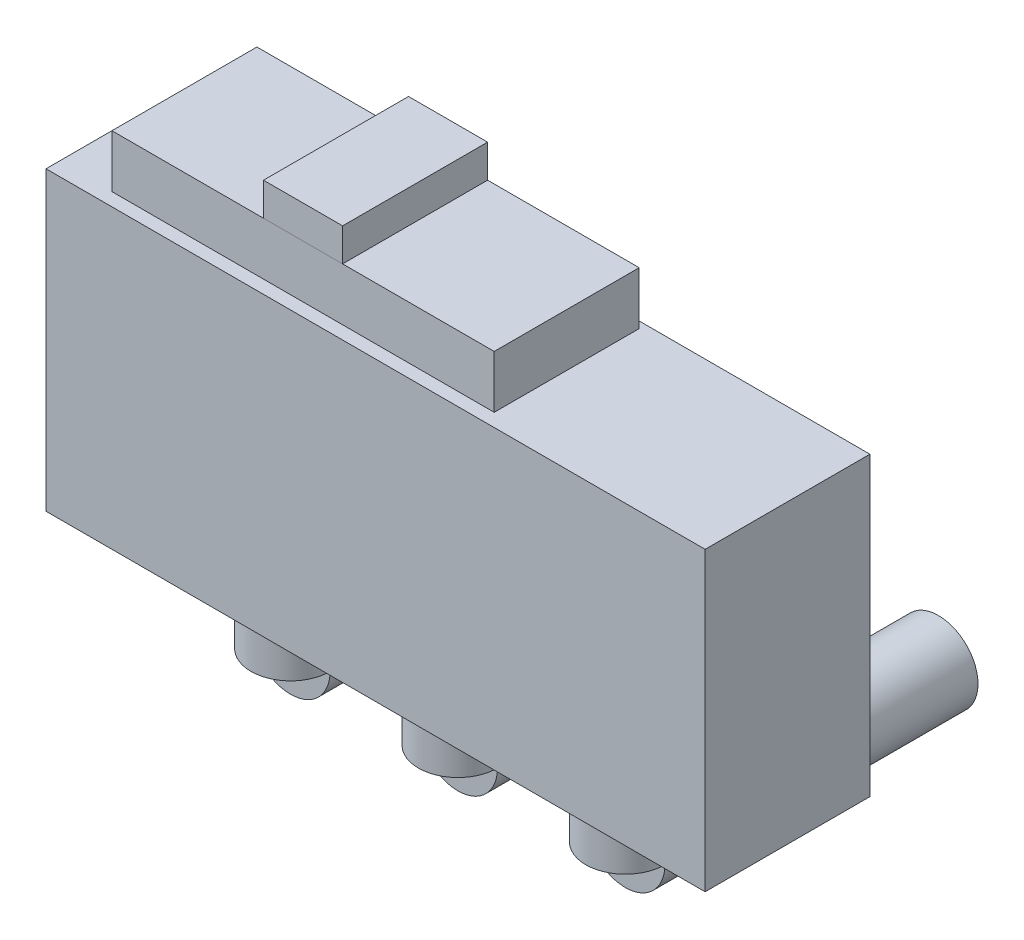
ISO-10303-21;
HEADER;
FILE_DESCRIPTION(('STEP AP214'),'2;1');
FILE_NAME('part.step','',(''),(''),'','','');
FILE_SCHEMA(('AUTOMOTIVE_DESIGN { 1 0 10303 214 1 1 1 1 }'));
ENDSEC;
DATA;
#1=APPLICATION_CONTEXT('core data for automotive mechanical design processes');
#2=APPLICATION_PROTOCOL_DEFINITION('international standard','automotive_design',2000,#1);
#3=PRODUCT_CONTEXT('',#1,'mechanical');
#4=PRODUCT('Part','Part','',(#3));
#5=PRODUCT_RELATED_PRODUCT_CATEGORY('part','',(#4));
#6=PRODUCT_DEFINITION_FORMATION('','',#4);
#7=PRODUCT_DEFINITION_CONTEXT('part definition',#1,'design');
#8=PRODUCT_DEFINITION('design','',#6,#7);
#9=PRODUCT_DEFINITION_SHAPE('','',#8);
#10=(LENGTH_UNIT() NAMED_UNIT(*) SI_UNIT(.MILLI.,.METRE.));
#11=(NAMED_UNIT(*) PLANE_ANGLE_UNIT() SI_UNIT($,.RADIAN.));
#12=(NAMED_UNIT(*) SI_UNIT($,.STERADIAN.) SOLID_ANGLE_UNIT());
#13=UNCERTAINTY_MEASURE_WITH_UNIT(LENGTH_MEASURE(1.E-05),#10,'distance_accuracy_value','');
#14=(GEOMETRIC_REPRESENTATION_CONTEXT(3) GLOBAL_UNCERTAINTY_ASSIGNED_CONTEXT((#13)) GLOBAL_UNIT_ASSIGNED_CONTEXT((#10,
#11,#12)) REPRESENTATION_CONTEXT('',''));
#15=CARTESIAN_POINT('',(0.,0.,0.));
#16=DIRECTION('',(0.,0.,1.));
#17=DIRECTION('',(1.,0.,0.));
#18=AXIS2_PLACEMENT_3D('',#15,#16,#17);
#19=CARTESIAN_POINT('',(-2.54E-05,2.54E-06,-3.50000062));
#20=DIRECTION('',(0.,0.,-1.));
#21=DIRECTION('',(1.,0.,0.));
#22=AXIS2_PLACEMENT_3D('',#19,#20,#21);
#23=CYLINDRICAL_SURFACE('',#22,0.5999988);
#24=CARTESIAN_POINT('',(-2.54E-05,2.54E-06,-3.50000062));
#25=DIRECTION('',(0.,0.,1.));
#26=DIRECTION('',(1.,0.,0.));
#27=AXIS2_PLACEMENT_3D('',#24,#25,#26);
#28=CIRCLE('',#27,0.5999988);
#29=CARTESIAN_POINT('',(0.5999734,2.53999999985304E-06,-3.50000062));
#30=VERTEX_POINT('',#29);
#31=EDGE_CURVE('P0_E11',#30,#30,#28,.T.);
#32=ORIENTED_EDGE('',*,*,#31,.T.);
#33=DIRECTION('',(0.,0.,1.));
#34=VECTOR('',#33,1.);
#35=CARTESIAN_POINT('',(0.5999734,2.53999999985304E-06,-3.50000062));
#36=LINE('',#35,#34);
#37=CARTESIAN_POINT('',(0.5999734,2.53999999985304E-06,1.25000004));
#38=VERTEX_POINT('',#37);
#39=EDGE_CURVE('P0_E24',#30,#38,#36,.T.);
#40=ORIENTED_EDGE('',*,*,#39,.T.);
#41=CARTESIAN_POINT('',(-2.54E-05,2.54E-06,1.25000004));
#42=DIRECTION('',(0.,0.,1.));
#43=DIRECTION('',(1.,0.,0.));
#44=AXIS2_PLACEMENT_3D('',#41,#42,#43);
#45=CIRCLE('',#44,0.5999988);
#46=EDGE_CURVE('P0_E32',#38,#38,#45,.T.);
#47=ORIENTED_EDGE('',*,*,#46,.F.);
#48=ORIENTED_EDGE('',*,*,#39,.F.);
#49=EDGE_LOOP('',(#32,#40,#47,#48));
#50=FACE_BOUND('',#49,.T.);
#51=ADVANCED_FACE('P0_F17',(#50),#23,.T.);
#52=CARTESIAN_POINT('',(-2.54000000000356E-05,2.53999999997551E-06,-3.50000062));
#53=DIRECTION('',(0.,0.,1.));
#54=DIRECTION('',(1.,0.,0.));
#55=AXIS2_PLACEMENT_3D('',#52,#53,#54);
#56=PLANE('',#55);
#57=ORIENTED_EDGE('',*,*,#31,.F.);
#58=EDGE_LOOP('',(#57));
#59=FACE_BOUND('',#58,.T.);
#60=ADVANCED_FACE('P0_F37',(#59),#56,.F.);
#61=CARTESIAN_POINT('',(-2.54000000000356E-05,2.53999999997551E-06,1.25000004));
#62=DIRECTION('',(0.,0.,1.));
#63=DIRECTION('',(1.,0.,0.));
#64=AXIS2_PLACEMENT_3D('',#61,#62,#63);
#65=PLANE('',#64);
#66=ORIENTED_EDGE('',*,*,#46,.T.);
#67=EDGE_LOOP('',(#66));
#68=FACE_BOUND('',#67,.T.);
#69=ADVANCED_FACE('P0_F34',(#68),#65,.T.);
#70=CLOSED_SHELL('',(#51,#60,#69));
#71=MANIFOLD_SOLID_BREP('P0_B1',#70);
#72=CARTESIAN_POINT('',(-5.00000016,1.1999976,0.));
#73=DIRECTION('',(0.,1.,0.));
#74=DIRECTION('',(1.,0.,0.));
#75=AXIS2_PLACEMENT_3D('',#72,#73,#74);
#76=PLANE('',#75);
#77=DIRECTION('',(1.,0.,0.));
#78=VECTOR('',#77,1.);
#79=CARTESIAN_POINT('',(-5.00000016,1.1999976,0.));
#80=LINE('',#79,#78);
#81=CARTESIAN_POINT('',(-5.00000016,1.1999976,0.));
#82=VERTEX_POINT('',#81);
#83=CARTESIAN_POINT('',(5.00000016,1.1999976,0.));
#84=VERTEX_POINT('',#83);
#85=EDGE_CURVE('P1_E11',#82,#84,#80,.T.);
#86=ORIENTED_EDGE('',*,*,#85,.T.);
#87=DIRECTION('',(0.,0.,1.));
#88=VECTOR('',#87,1.);
#89=CARTESIAN_POINT('',(5.00000016,1.1999976,0.));
#90=LINE('',#89,#88);
#91=CARTESIAN_POINT('',(5.00000016,1.1999976,2.50000008));
#92=VERTEX_POINT('',#91);
#93=EDGE_CURVE('P1_E24',#84,#92,#90,.T.);
#94=ORIENTED_EDGE('',*,*,#93,.T.);
#95=DIRECTION('',(1.,0.,0.));
#96=VECTOR('',#95,1.);
#97=CARTESIAN_POINT('',(-5.00000016,1.1999976,2.50000008));
#98=LINE('',#97,#96);
#99=CARTESIAN_POINT('',(-5.00000016,1.1999976,2.50000008));
#100=VERTEX_POINT('',#99);
#101=EDGE_CURVE('P1_E87',#100,#92,#98,.T.);
#102=ORIENTED_EDGE('',*,*,#101,.F.);
#103=DIRECTION('',(0.,0.,1.));
#104=VECTOR('',#103,1.);
#105=CARTESIAN_POINT('',(-5.00000016,1.1999976,0.));
#106=LINE('',#105,#104);
#107=EDGE_CURVE('P1_E36',#82,#100,#106,.T.);
#108=ORIENTED_EDGE('',*,*,#107,.F.);
#109=EDGE_LOOP('',(#86,#94,#102,#108));
#110=FACE_BOUND('',#109,.T.);
#111=ADVANCED_FACE('P1_F17',(#110),#76,.F.);
#112=CARTESIAN_POINT('',(5.00000016,1.1999976,0.));
#113=DIRECTION('',(-1.,0.,0.));
#114=DIRECTION('',(0.,1.,0.));
#115=AXIS2_PLACEMENT_3D('',#112,#113,#114);
#116=PLANE('',#115);
#117=DIRECTION('',(0.,1.,0.));
#118=VECTOR('',#117,1.);
#119=CARTESIAN_POINT('',(5.00000016,1.1999976,0.));
#120=LINE('',#119,#118);
#121=CARTESIAN_POINT('',(5.00000016,5.69999622,0.));
#122=VERTEX_POINT('',#121);
#123=EDGE_CURVE('P1_E84',#84,#122,#120,.T.);
#124=ORIENTED_EDGE('',*,*,#123,.T.);
#125=DIRECTION('',(0.,0.,1.));
#126=VECTOR('',#125,1.);
#127=CARTESIAN_POINT('',(5.00000016,5.69999622,0.));
#128=LINE('',#127,#126);
#129=CARTESIAN_POINT('',(5.00000016,5.69999622,2.50000008));
#130=VERTEX_POINT('',#129);
#131=EDGE_CURVE('P1_E82',#122,#130,#128,.T.);
#132=ORIENTED_EDGE('',*,*,#131,.T.);
#133=DIRECTION('',(0.,1.,0.));
#134=VECTOR('',#133,1.);
#135=CARTESIAN_POINT('',(5.00000016,1.1999976,2.50000008));
#136=LINE('',#135,#134);
#137=EDGE_CURVE('P1_E62',#92,#130,#136,.T.);
#138=ORIENTED_EDGE('',*,*,#137,.F.);
#139=ORIENTED_EDGE('',*,*,#93,.F.);
#140=EDGE_LOOP('',(#124,#132,#138,#139));
#141=FACE_BOUND('',#140,.T.);
#142=ADVANCED_FACE('P1_F89',(#141),#116,.F.);
#143=CARTESIAN_POINT('',(5.00000016,5.69999622,0.));
#144=DIRECTION('',(0.,-1.,0.));
#145=DIRECTION('',(-1.,0.,0.));
#146=AXIS2_PLACEMENT_3D('',#143,#144,#145);
#147=PLANE('',#146);
#148=DIRECTION('',(-1.,0.,0.));
#149=VECTOR('',#148,1.);
#150=CARTESIAN_POINT('',(5.00000016,5.69999622,0.));
#151=LINE('',#150,#149);
#152=CARTESIAN_POINT('',(-5.00000016,5.69999622,0.));
#153=VERTEX_POINT('',#152);
#154=EDGE_CURVE('P1_E71',#122,#153,#151,.T.);
#155=ORIENTED_EDGE('',*,*,#154,.T.);
#156=DIRECTION('',(0.,0.,1.));
#157=VECTOR('',#156,1.);
#158=CARTESIAN_POINT('',(-5.00000016,5.69999622,0.));
#159=LINE('',#158,#157);
#160=CARTESIAN_POINT('',(-5.00000016,5.69999622,2.50000008));
#161=VERTEX_POINT('',#160);
#162=EDGE_CURVE('P1_E65',#153,#161,#159,.T.);
#163=ORIENTED_EDGE('',*,*,#162,.T.);
#164=DIRECTION('',(-1.,0.,0.));
#165=VECTOR('',#164,1.);
#166=CARTESIAN_POINT('',(5.00000016,5.69999622,2.50000008));
#167=LINE('',#166,#165);
#168=EDGE_CURVE('P1_E57',#130,#161,#167,.T.);
#169=ORIENTED_EDGE('',*,*,#168,.F.);
#170=ORIENTED_EDGE('',*,*,#131,.F.);
#171=EDGE_LOOP('',(#155,#163,#169,#170));
#172=FACE_BOUND('',#171,.T.);
#173=ADVANCED_FACE('P1_F69',(#172),#147,.F.);
#174=CARTESIAN_POINT('',(-5.00000016,5.69999622,0.));
#175=DIRECTION('',(1.,0.,0.));
#176=DIRECTION('',(0.,-1.,0.));
#177=AXIS2_PLACEMENT_3D('',#174,#175,#176);
#178=PLANE('',#177);
#179=DIRECTION('',(0.,-1.,0.));
#180=VECTOR('',#179,1.);
#181=CARTESIAN_POINT('',(-5.00000016,5.69999622,0.));
#182=LINE('',#181,#180);
#183=EDGE_CURVE('P1_E66',#153,#82,#182,.T.);
#184=ORIENTED_EDGE('',*,*,#183,.T.);
#185=ORIENTED_EDGE('',*,*,#107,.T.);
#186=DIRECTION('',(0.,-1.,0.));
#187=VECTOR('',#186,1.);
#188=CARTESIAN_POINT('',(-5.00000016,5.69999622,2.50000008));
#189=LINE('',#188,#187);
#190=EDGE_CURVE('P1_E61',#161,#100,#189,.T.);
#191=ORIENTED_EDGE('',*,*,#190,.F.);
#192=ORIENTED_EDGE('',*,*,#162,.F.);
#193=EDGE_LOOP('',(#184,#185,#191,#192));
#194=FACE_BOUND('',#193,.T.);
#195=ADVANCED_FACE('P1_F76',(#194),#178,.F.);
#196=CARTESIAN_POINT('',(0.,3.44999691,0.));
#197=DIRECTION('',(0.,0.,1.));
#198=DIRECTION('',(-1.,0.,0.));
#199=AXIS2_PLACEMENT_3D('',#196,#197,#198);
#200=PLANE('',#199);
#201=ORIENTED_EDGE('',*,*,#183,.F.);
#202=ORIENTED_EDGE('',*,*,#154,.F.);
#203=ORIENTED_EDGE('',*,*,#123,.F.);
#204=ORIENTED_EDGE('',*,*,#85,.F.);
#205=EDGE_LOOP('',(#201,#202,#203,#204));
#206=FACE_BOUND('',#205,.T.);
#207=ADVANCED_FACE('P1_F91',(#206),#200,.F.);
#208=CARTESIAN_POINT('',(0.,3.44999691,2.50000008));
#209=DIRECTION('',(0.,0.,1.));
#210=DIRECTION('',(-1.,0.,0.));
#211=AXIS2_PLACEMENT_3D('',#208,#209,#210);
#212=PLANE('',#211);
#213=ORIENTED_EDGE('',*,*,#101,.T.);
#214=ORIENTED_EDGE('',*,*,#137,.T.);
#215=ORIENTED_EDGE('',*,*,#168,.T.);
#216=ORIENTED_EDGE('',*,*,#190,.T.);
#217=EDGE_LOOP('',(#213,#214,#215,#216));
#218=FACE_BOUND('',#217,.T.);
#219=ADVANCED_FACE('P1_F59',(#218),#212,.T.);
#220=CLOSED_SHELL('',(#111,#142,#173,#195,#207,#219));
#221=MANIFOLD_SOLID_BREP('P1_B1',#220);
#222=CARTESIAN_POINT('',(2.5399746,2.54E-06,-3.50000062));
#223=DIRECTION('',(0.,0.,-1.));
#224=DIRECTION('',(1.,0.,0.));
#225=AXIS2_PLACEMENT_3D('',#222,#223,#224);
#226=CYLINDRICAL_SURFACE('',#225,0.5999988);
#227=CARTESIAN_POINT('',(2.5399746,2.54E-06,-3.50000062));
#228=DIRECTION('',(0.,0.,1.));
#229=DIRECTION('',(1.,0.,0.));
#230=AXIS2_PLACEMENT_3D('',#227,#228,#229);
#231=CIRCLE('',#230,0.5999988);
#232=CARTESIAN_POINT('',(3.1399734,2.53999999985304E-06,-3.50000062));
#233=VERTEX_POINT('',#232);
#234=EDGE_CURVE('P2_E11',#233,#233,#231,.T.);
#235=ORIENTED_EDGE('',*,*,#234,.T.);
#236=DIRECTION('',(0.,0.,1.));
#237=VECTOR('',#236,1.);
#238=CARTESIAN_POINT('',(3.1399734,2.53999999985304E-06,-3.50000062));
#239=LINE('',#238,#237);
#240=CARTESIAN_POINT('',(3.1399734,2.53999999985304E-06,1.25000004));
#241=VERTEX_POINT('',#240);
#242=EDGE_CURVE('P2_E24',#233,#241,#239,.T.);
#243=ORIENTED_EDGE('',*,*,#242,.T.);
#244=CARTESIAN_POINT('',(2.5399746,2.54E-06,1.25000004));
#245=DIRECTION('',(0.,0.,1.));
#246=DIRECTION('',(1.,0.,0.));
#247=AXIS2_PLACEMENT_3D('',#244,#245,#246);
#248=CIRCLE('',#247,0.5999988);
#249=EDGE_CURVE('P2_E32',#241,#241,#248,.T.);
#250=ORIENTED_EDGE('',*,*,#249,.F.);
#251=ORIENTED_EDGE('',*,*,#242,.F.);
#252=EDGE_LOOP('',(#235,#243,#250,#251));
#253=FACE_BOUND('',#252,.T.);
#254=ADVANCED_FACE('P2_F17',(#253),#226,.T.);
#255=CARTESIAN_POINT('',(2.5399746,2.53999999997551E-06,-3.50000062));
#256=DIRECTION('',(0.,0.,1.));
#257=DIRECTION('',(1.,0.,0.));
#258=AXIS2_PLACEMENT_3D('',#255,#256,#257);
#259=PLANE('',#258);
#260=ORIENTED_EDGE('',*,*,#234,.F.);
#261=EDGE_LOOP('',(#260));
#262=FACE_BOUND('',#261,.T.);
#263=ADVANCED_FACE('P2_F37',(#262),#259,.F.);
#264=CARTESIAN_POINT('',(2.5399746,2.53999999997551E-06,1.25000004));
#265=DIRECTION('',(0.,0.,1.));
#266=DIRECTION('',(1.,0.,0.));
#267=AXIS2_PLACEMENT_3D('',#264,#265,#266);
#268=PLANE('',#267);
#269=ORIENTED_EDGE('',*,*,#249,.T.);
#270=EDGE_LOOP('',(#269));
#271=FACE_BOUND('',#270,.T.);
#272=ADVANCED_FACE('P2_F34',(#271),#268,.T.);
#273=CLOSED_SHELL('',(#254,#263,#272));
#274=MANIFOLD_SOLID_BREP('P2_B1',#273);
#275=CARTESIAN_POINT('',(-2.5400254,2.54E-06,-3.50000062));
#276=DIRECTION('',(0.,0.,-1.));
#277=DIRECTION('',(1.,0.,0.));
#278=AXIS2_PLACEMENT_3D('',#275,#276,#277);
#279=CYLINDRICAL_SURFACE('',#278,0.5999988);
#280=CARTESIAN_POINT('',(-2.5400254,2.54E-06,-3.50000062));
#281=DIRECTION('',(0.,0.,1.));
#282=DIRECTION('',(1.,0.,0.));
#283=AXIS2_PLACEMENT_3D('',#280,#281,#282);
#284=CIRCLE('',#283,0.5999988);
#285=CARTESIAN_POINT('',(-1.9400266,2.53999999985304E-06,-3.50000062));
#286=VERTEX_POINT('',#285);
#287=EDGE_CURVE('P3_E11',#286,#286,#284,.T.);
#288=ORIENTED_EDGE('',*,*,#287,.T.);
#289=DIRECTION('',(0.,0.,1.));
#290=VECTOR('',#289,1.);
#291=CARTESIAN_POINT('',(-1.9400266,2.53999999985304E-06,-3.50000062));
#292=LINE('',#291,#290);
#293=CARTESIAN_POINT('',(-1.9400266,2.53999999985304E-06,1.25000004));
#294=VERTEX_POINT('',#293);
#295=EDGE_CURVE('P3_E24',#286,#294,#292,.T.);
#296=ORIENTED_EDGE('',*,*,#295,.T.);
#297=CARTESIAN_POINT('',(-2.5400254,2.54E-06,1.25000004));
#298=DIRECTION('',(0.,0.,1.));
#299=DIRECTION('',(1.,0.,0.));
#300=AXIS2_PLACEMENT_3D('',#297,#298,#299);
#301=CIRCLE('',#300,0.5999988);
#302=EDGE_CURVE('P3_E32',#294,#294,#301,.T.);
#303=ORIENTED_EDGE('',*,*,#302,.F.);
#304=ORIENTED_EDGE('',*,*,#295,.F.);
#305=EDGE_LOOP('',(#288,#296,#303,#304));
#306=FACE_BOUND('',#305,.T.);
#307=ADVANCED_FACE('P3_F17',(#306),#279,.T.);
#308=CARTESIAN_POINT('',(-2.5400254,2.53999999997551E-06,-3.50000062));
#309=DIRECTION('',(0.,0.,1.));
#310=DIRECTION('',(1.,0.,0.));
#311=AXIS2_PLACEMENT_3D('',#308,#309,#310);
#312=PLANE('',#311);
#313=ORIENTED_EDGE('',*,*,#287,.F.);
#314=EDGE_LOOP('',(#313));
#315=FACE_BOUND('',#314,.T.);
#316=ADVANCED_FACE('P3_F37',(#315),#312,.F.);
#317=CARTESIAN_POINT('',(-2.5400254,2.53999999997551E-06,1.25000004));
#318=DIRECTION('',(0.,0.,1.));
#319=DIRECTION('',(1.,0.,0.));
#320=AXIS2_PLACEMENT_3D('',#317,#318,#319);
#321=PLANE('',#320);
#322=ORIENTED_EDGE('',*,*,#302,.T.);
#323=EDGE_LOOP('',(#322));
#324=FACE_BOUND('',#323,.T.);
#325=ADVANCED_FACE('P3_F34',(#324),#321,.T.);
#326=CLOSED_SHELL('',(#307,#316,#325));
#327=MANIFOLD_SOLID_BREP('P3_B1',#326);
#328=CARTESIAN_POINT('',(-2.5400254,2.032E-05,1.25000004));
#329=DIRECTION('',(0.,-1.,0.));
#330=DIRECTION('',(0.,0.,1.));
#331=AXIS2_PLACEMENT_3D('',#328,#329,#330);
#332=CYLINDRICAL_SURFACE('',#331,0.5999988);
#333=CARTESIAN_POINT('',(-2.5400254,2.032E-05,1.25000004));
#334=DIRECTION('',(0.,1.,0.));
#335=DIRECTION('',(0.,0.,1.));
#336=AXIS2_PLACEMENT_3D('',#333,#334,#335);
#337=CIRCLE('',#336,0.5999988);
#338=CARTESIAN_POINT('',(-2.5400254,2.03199999999633E-05,1.84999884));
#339=VERTEX_POINT('',#338);
#340=EDGE_CURVE('P4_E11',#339,#339,#337,.T.);
#341=ORIENTED_EDGE('',*,*,#340,.T.);
#342=DIRECTION('',(0.,1.,0.));
#343=VECTOR('',#342,1.);
#344=CARTESIAN_POINT('',(-2.5400254,2.03199999999633E-05,1.84999884));
#345=LINE('',#344,#343);
#346=CARTESIAN_POINT('',(-2.5400254,1.20002046,1.84999884));
#347=VERTEX_POINT('',#346);
#348=EDGE_CURVE('P4_E24',#339,#347,#345,.T.);
#349=ORIENTED_EDGE('',*,*,#348,.T.);
#350=CARTESIAN_POINT('',(-2.5400254,1.20002046,1.25000004));
#351=DIRECTION('',(0.,1.,0.));
#352=DIRECTION('',(0.,0.,1.));
#353=AXIS2_PLACEMENT_3D('',#350,#351,#352);
#354=CIRCLE('',#353,0.5999988);
#355=EDGE_CURVE('P4_E32',#347,#347,#354,.T.);
#356=ORIENTED_EDGE('',*,*,#355,.F.);
#357=ORIENTED_EDGE('',*,*,#348,.F.);
#358=EDGE_LOOP('',(#341,#349,#356,#357));
#359=FACE_BOUND('',#358,.T.);
#360=ADVANCED_FACE('P4_F17',(#359),#332,.T.);
#361=CARTESIAN_POINT('',(-2.5400254,2.032E-05,1.25000004));
#362=DIRECTION('',(0.,1.,0.));
#363=DIRECTION('',(0.,0.,1.));
#364=AXIS2_PLACEMENT_3D('',#361,#362,#363);
#365=PLANE('',#364);
#366=ORIENTED_EDGE('',*,*,#340,.F.);
#367=EDGE_LOOP('',(#366));
#368=FACE_BOUND('',#367,.T.);
#369=ADVANCED_FACE('P4_F37',(#368),#365,.F.);
#370=CARTESIAN_POINT('',(-2.5400254,1.20002046,1.25000004));
#371=DIRECTION('',(0.,1.,0.));
#372=DIRECTION('',(0.,0.,1.));
#373=AXIS2_PLACEMENT_3D('',#370,#371,#372);
#374=PLANE('',#373);
#375=ORIENTED_EDGE('',*,*,#355,.T.);
#376=EDGE_LOOP('',(#375));
#377=FACE_BOUND('',#376,.T.);
#378=ADVANCED_FACE('P4_F34',(#377),#374,.T.);
#379=CLOSED_SHELL('',(#360,#369,#378));
#380=MANIFOLD_SOLID_BREP('P4_B1',#379);
#381=CARTESIAN_POINT('',(-2.54E-05,2.032E-05,1.25000004));
#382=DIRECTION('',(0.,-1.,0.));
#383=DIRECTION('',(0.,0.,1.));
#384=AXIS2_PLACEMENT_3D('',#381,#382,#383);
#385=CYLINDRICAL_SURFACE('',#384,0.5999988);
#386=CARTESIAN_POINT('',(-2.54E-05,2.032E-05,1.25000004));
#387=DIRECTION('',(0.,1.,0.));
#388=DIRECTION('',(0.,0.,1.));
#389=AXIS2_PLACEMENT_3D('',#386,#387,#388);
#390=CIRCLE('',#389,0.5999988);
#391=CARTESIAN_POINT('',(-2.54E-05,2.03199999999633E-05,1.84999884));
#392=VERTEX_POINT('',#391);
#393=EDGE_CURVE('P5_E11',#392,#392,#390,.T.);
#394=ORIENTED_EDGE('',*,*,#393,.T.);
#395=DIRECTION('',(0.,1.,0.));
#396=VECTOR('',#395,1.);
#397=CARTESIAN_POINT('',(-2.54E-05,2.03199999999633E-05,1.84999884));
#398=LINE('',#397,#396);
#399=CARTESIAN_POINT('',(-2.53999999997796E-05,1.20002046,1.84999884));
#400=VERTEX_POINT('',#399);
#401=EDGE_CURVE('P5_E24',#392,#400,#398,.T.);
#402=ORIENTED_EDGE('',*,*,#401,.T.);
#403=CARTESIAN_POINT('',(-2.53999999997796E-05,1.20002046,1.25000004));
#404=DIRECTION('',(0.,1.,0.));
#405=DIRECTION('',(0.,0.,1.));
#406=AXIS2_PLACEMENT_3D('',#403,#404,#405);
#407=CIRCLE('',#406,0.5999988);
#408=EDGE_CURVE('P5_E32',#400,#400,#407,.T.);
#409=ORIENTED_EDGE('',*,*,#408,.F.);
#410=ORIENTED_EDGE('',*,*,#401,.F.);
#411=EDGE_LOOP('',(#394,#402,#409,#410));
#412=FACE_BOUND('',#411,.T.);
#413=ADVANCED_FACE('P5_F17',(#412),#385,.T.);
#414=CARTESIAN_POINT('',(-2.54000000000245E-05,2.032E-05,1.25000004));
#415=DIRECTION('',(0.,1.,0.));
#416=DIRECTION('',(0.,0.,1.));
#417=AXIS2_PLACEMENT_3D('',#414,#415,#416);
#418=PLANE('',#417);
#419=ORIENTED_EDGE('',*,*,#393,.F.);
#420=EDGE_LOOP('',(#419));
#421=FACE_BOUND('',#420,.T.);
#422=ADVANCED_FACE('P5_F37',(#421),#418,.F.);
#423=CARTESIAN_POINT('',(-2.53999999998041E-05,1.20002046,1.25000004));
#424=DIRECTION('',(0.,1.,0.));
#425=DIRECTION('',(0.,0.,1.));
#426=AXIS2_PLACEMENT_3D('',#423,#424,#425);
#427=PLANE('',#426);
#428=ORIENTED_EDGE('',*,*,#408,.T.);
#429=EDGE_LOOP('',(#428));
#430=FACE_BOUND('',#429,.T.);
#431=ADVANCED_FACE('P5_F34',(#430),#427,.T.);
#432=CLOSED_SHELL('',(#413,#422,#431));
#433=MANIFOLD_SOLID_BREP('P5_B1',#432);
#434=CARTESIAN_POINT('',(2.5399746,2.032E-05,1.25000004));
#435=DIRECTION('',(0.,-1.,0.));
#436=DIRECTION('',(0.,0.,1.));
#437=AXIS2_PLACEMENT_3D('',#434,#435,#436);
#438=CYLINDRICAL_SURFACE('',#437,0.5999988);
#439=CARTESIAN_POINT('',(2.5399746,2.032E-05,1.25000004));
#440=DIRECTION('',(0.,1.,0.));
#441=DIRECTION('',(0.,0.,1.));
#442=AXIS2_PLACEMENT_3D('',#439,#440,#441);
#443=CIRCLE('',#442,0.5999988);
#444=CARTESIAN_POINT('',(2.5399746,2.03199999999633E-05,1.84999884));
#445=VERTEX_POINT('',#444);
#446=EDGE_CURVE('P6_E11',#445,#445,#443,.T.);
#447=ORIENTED_EDGE('',*,*,#446,.T.);
#448=DIRECTION('',(0.,1.,0.));
#449=VECTOR('',#448,1.);
#450=CARTESIAN_POINT('',(2.5399746,2.03199999999633E-05,1.84999884));
#451=LINE('',#450,#449);
#452=CARTESIAN_POINT('',(2.5399746,1.20002046,1.84999884));
#453=VERTEX_POINT('',#452);
#454=EDGE_CURVE('P6_E24',#445,#453,#451,.T.);
#455=ORIENTED_EDGE('',*,*,#454,.T.);
#456=CARTESIAN_POINT('',(2.5399746,1.20002046,1.25000004));
#457=DIRECTION('',(0.,1.,0.));
#458=DIRECTION('',(0.,0.,1.));
#459=AXIS2_PLACEMENT_3D('',#456,#457,#458);
#460=CIRCLE('',#459,0.5999988);
#461=EDGE_CURVE('P6_E32',#453,#453,#460,.T.);
#462=ORIENTED_EDGE('',*,*,#461,.F.);
#463=ORIENTED_EDGE('',*,*,#454,.F.);
#464=EDGE_LOOP('',(#447,#455,#462,#463));
#465=FACE_BOUND('',#464,.T.);
#466=ADVANCED_FACE('P6_F17',(#465),#438,.T.);
#467=CARTESIAN_POINT('',(2.5399746,2.032E-05,1.25000004));
#468=DIRECTION('',(0.,1.,0.));
#469=DIRECTION('',(0.,0.,1.));
#470=AXIS2_PLACEMENT_3D('',#467,#468,#469);
#471=PLANE('',#470);
#472=ORIENTED_EDGE('',*,*,#446,.F.);
#473=EDGE_LOOP('',(#472));
#474=FACE_BOUND('',#473,.T.);
#475=ADVANCED_FACE('P6_F37',(#474),#471,.F.);
#476=CARTESIAN_POINT('',(2.5399746,1.20002046,1.25000004));
#477=DIRECTION('',(0.,1.,0.));
#478=DIRECTION('',(0.,0.,1.));
#479=AXIS2_PLACEMENT_3D('',#476,#477,#478);
#480=PLANE('',#479);
#481=ORIENTED_EDGE('',*,*,#461,.T.);
#482=EDGE_LOOP('',(#481));
#483=FACE_BOUND('',#482,.T.);
#484=ADVANCED_FACE('P6_F34',(#483),#480,.T.);
#485=CLOSED_SHELL('',(#466,#475,#484));
#486=MANIFOLD_SOLID_BREP('P6_B1',#485);
#487=CARTESIAN_POINT('',(-4.19999922,6.49999716,0.0999998));
#488=DIRECTION('',(0.,1.,0.));
#489=DIRECTION('',(1.,0.,0.));
#490=AXIS2_PLACEMENT_3D('',#487,#488,#489);
#491=PLANE('',#490);
#492=DIRECTION('',(0.,0.,1.));
#493=VECTOR('',#492,1.);
#494=CARTESIAN_POINT('',(-4.19999922,6.49999716,0.0999998));
#495=LINE('',#494,#493);
#496=CARTESIAN_POINT('',(-4.19999922,6.49999716,0.0999998));
#497=VERTEX_POINT('',#496);
#498=CARTESIAN_POINT('',(-4.19999922,6.49999716,2.30000048));
#499=VERTEX_POINT('',#498);
#500=EDGE_CURVE('P7_E11',#497,#499,#495,.T.);
#501=ORIENTED_EDGE('',*,*,#500,.T.);
#502=DIRECTION('',(1.,0.,0.));
#503=VECTOR('',#502,1.);
#504=CARTESIAN_POINT('',(-4.19999922,6.49999716,2.30000048));
#505=LINE('',#504,#503);
#506=CARTESIAN_POINT('',(1.59999934,6.49999716,2.30000048));
#507=VERTEX_POINT('',#506);
#508=EDGE_CURVE('P7_E24',#499,#507,#505,.T.);
#509=ORIENTED_EDGE('',*,*,#508,.T.);
#510=DIRECTION('',(0.,0.,1.));
#511=VECTOR('',#510,1.);
#512=CARTESIAN_POINT('',(1.59999934,6.49999716,0.0999998));
#513=LINE('',#512,#511);
#514=CARTESIAN_POINT('',(1.59999934,6.49999716,0.0999998));
#515=VERTEX_POINT('',#514);
#516=EDGE_CURVE('P7_E85',#515,#507,#513,.T.);
#517=ORIENTED_EDGE('',*,*,#516,.F.);
#518=DIRECTION('',(1.,0.,0.));
#519=VECTOR('',#518,1.);
#520=CARTESIAN_POINT('',(-4.19999922,6.49999716,0.0999998));
#521=LINE('',#520,#519);
#522=EDGE_CURVE('P7_E83',#497,#515,#521,.T.);
#523=ORIENTED_EDGE('',*,*,#522,.F.);
#524=EDGE_LOOP('',(#501,#509,#517,#523));
#525=FACE_BOUND('',#524,.T.);
#526=ADVANCED_FACE('P7_F17',(#525),#491,.T.);
#527=CARTESIAN_POINT('',(1.59999934,6.49999716,0.0999998));
#528=DIRECTION('',(1.,0.,0.));
#529=DIRECTION('',(0.,-1.,0.));
#530=AXIS2_PLACEMENT_3D('',#527,#528,#529);
#531=PLANE('',#530);
#532=ORIENTED_EDGE('',*,*,#516,.T.);
#533=DIRECTION('',(0.,-1.,0.));
#534=VECTOR('',#533,1.);
#535=CARTESIAN_POINT('',(1.59999934,6.49999716,2.30000048));
#536=LINE('',#535,#534);
#537=CARTESIAN_POINT('',(1.59999934,5.69999622,2.30000048));
#538=VERTEX_POINT('',#537);
#539=EDGE_CURVE('P7_E81',#507,#538,#536,.T.);
#540=ORIENTED_EDGE('',*,*,#539,.T.);
#541=DIRECTION('',(0.,0.,1.));
#542=VECTOR('',#541,1.);
#543=CARTESIAN_POINT('',(1.59999934,5.69999622,0.0999998));
#544=LINE('',#543,#542);
#545=CARTESIAN_POINT('',(1.59999934,5.69999622,0.0999998));
#546=VERTEX_POINT('',#545);
#547=EDGE_CURVE('P7_E79',#546,#538,#544,.T.);
#548=ORIENTED_EDGE('',*,*,#547,.F.);
#549=DIRECTION('',(0.,-1.,0.));
#550=VECTOR('',#549,1.);
#551=CARTESIAN_POINT('',(1.59999934,6.49999716,0.0999998));
#552=LINE('',#551,#550);
#553=EDGE_CURVE('P7_E70',#515,#546,#552,.T.);
#554=ORIENTED_EDGE('',*,*,#553,.F.);
#555=EDGE_LOOP('',(#532,#540,#548,#554));
#556=FACE_BOUND('',#555,.T.);
#557=ADVANCED_FACE('P7_F90',(#556),#531,.T.);
#558=CARTESIAN_POINT('',(1.59999934,5.69999622,0.0999998));
#559=DIRECTION('',(0.,-1.,0.));
#560=DIRECTION('',(-1.,0.,0.));
#561=AXIS2_PLACEMENT_3D('',#558,#559,#560);
#562=PLANE('',#561);
#563=ORIENTED_EDGE('',*,*,#547,.T.);
#564=DIRECTION('',(-1.,0.,0.));
#565=VECTOR('',#564,1.);
#566=CARTESIAN_POINT('',(1.59999934,5.69999622,2.30000048));
#567=LINE('',#566,#565);
#568=CARTESIAN_POINT('',(-4.19999922,5.69999622,2.30000048));
#569=VERTEX_POINT('',#568);
#570=EDGE_CURVE('P7_E60',#538,#569,#567,.T.);
#571=ORIENTED_EDGE('',*,*,#570,.T.);
#572=DIRECTION('',(0.,0.,1.));
#573=VECTOR('',#572,1.);
#574=CARTESIAN_POINT('',(-4.19999922,5.69999622,0.0999998));
#575=LINE('',#574,#573);
#576=CARTESIAN_POINT('',(-4.19999922,5.69999622,0.0999998));
#577=VERTEX_POINT('',#576);
#578=EDGE_CURVE('P7_E54',#577,#569,#575,.T.);
#579=ORIENTED_EDGE('',*,*,#578,.F.);
#580=DIRECTION('',(-1.,0.,0.));
#581=VECTOR('',#580,1.);
#582=CARTESIAN_POINT('',(1.59999934,5.69999622,0.0999998));
#583=LINE('',#582,#581);
#584=EDGE_CURVE('P7_E58',#546,#577,#583,.T.);
#585=ORIENTED_EDGE('',*,*,#584,.F.);
#586=EDGE_LOOP('',(#563,#571,#579,#585));
#587=FACE_BOUND('',#586,.T.);
#588=ADVANCED_FACE('P7_F57',(#587),#562,.T.);
#589=CARTESIAN_POINT('',(-4.19999922,5.69999622,0.0999998));
#590=DIRECTION('',(-1.,0.,0.));
#591=DIRECTION('',(0.,1.,0.));
#592=AXIS2_PLACEMENT_3D('',#589,#590,#591);
#593=PLANE('',#592);
#594=ORIENTED_EDGE('',*,*,#578,.T.);
#595=DIRECTION('',(0.,1.,0.));
#596=VECTOR('',#595,1.);
#597=CARTESIAN_POINT('',(-4.19999922,5.69999622,2.30000048));
#598=LINE('',#597,#596);
#599=EDGE_CURVE('P7_E71',#569,#499,#598,.T.);
#600=ORIENTED_EDGE('',*,*,#599,.T.);
#601=ORIENTED_EDGE('',*,*,#500,.F.);
#602=DIRECTION('',(0.,1.,0.));
#603=VECTOR('',#602,1.);
#604=CARTESIAN_POINT('',(-4.19999922,5.69999622,0.0999998));
#605=LINE('',#604,#603);
#606=EDGE_CURVE('P7_E68',#577,#497,#605,.T.);
#607=ORIENTED_EDGE('',*,*,#606,.F.);
#608=EDGE_LOOP('',(#594,#600,#601,#607));
#609=FACE_BOUND('',#608,.T.);
#610=ADVANCED_FACE('P7_F73',(#609),#593,.T.);
#611=CARTESIAN_POINT('',(-1.29999994,6.09999669,0.0999998));
#612=DIRECTION('',(0.,0.,-1.));
#613=DIRECTION('',(1.,0.,0.));
#614=AXIS2_PLACEMENT_3D('',#611,#612,#613);
#615=PLANE('',#614);
#616=ORIENTED_EDGE('',*,*,#522,.T.);
#617=ORIENTED_EDGE('',*,*,#553,.T.);
#618=ORIENTED_EDGE('',*,*,#584,.T.);
#619=ORIENTED_EDGE('',*,*,#606,.T.);
#620=EDGE_LOOP('',(#616,#617,#618,#619));
#621=FACE_BOUND('',#620,.T.);
#622=ADVANCED_FACE('P7_F67',(#621),#615,.T.);
#623=CARTESIAN_POINT('',(-1.29999994,6.09999669,2.30000048));
#624=DIRECTION('',(0.,0.,-1.));
#625=DIRECTION('',(1.,0.,0.));
#626=AXIS2_PLACEMENT_3D('',#623,#624,#625);
#627=PLANE('',#626);
#628=ORIENTED_EDGE('',*,*,#599,.F.);
#629=ORIENTED_EDGE('',*,*,#570,.F.);
#630=ORIENTED_EDGE('',*,*,#539,.F.);
#631=ORIENTED_EDGE('',*,*,#508,.F.);
#632=EDGE_LOOP('',(#628,#629,#630,#631));
#633=FACE_BOUND('',#632,.T.);
#634=ADVANCED_FACE('P7_F91',(#633),#627,.F.);
#635=CLOSED_SHELL('',(#526,#557,#588,#610,#622,#634));
#636=MANIFOLD_SOLID_BREP('P7_B1',#635);
#637=CARTESIAN_POINT('',(-1.89999874,6.9999987,0.0999998));
#638=DIRECTION('',(0.,1.,0.));
#639=DIRECTION('',(1.,0.,0.));
#640=AXIS2_PLACEMENT_3D('',#637,#638,#639);
#641=PLANE('',#640);
#642=DIRECTION('',(0.,0.,1.));
#643=VECTOR('',#642,1.);
#644=CARTESIAN_POINT('',(-1.89999874,6.9999987,0.0999998));
#645=LINE('',#644,#643);
#646=CARTESIAN_POINT('',(-1.89999874,6.9999987,0.0999998));
#647=VERTEX_POINT('',#646);
#648=CARTESIAN_POINT('',(-1.89999874,6.9999987,2.30000048));
#649=VERTEX_POINT('',#648);
#650=EDGE_CURVE('P8_E10',#647,#649,#645,.T.);
#651=ORIENTED_EDGE('',*,*,#650,.T.);
#652=DIRECTION('',(1.,0.,0.));
#653=VECTOR('',#652,1.);
#654=CARTESIAN_POINT('',(-1.89999874,6.9999987,2.30000048));
#655=LINE('',#654,#653);
#656=CARTESIAN_POINT('',(-0.70000114,6.9999987,2.30000048));
#657=VERTEX_POINT('',#656);
#658=EDGE_CURVE('P8_E23',#649,#657,#655,.T.);
#659=ORIENTED_EDGE('',*,*,#658,.T.);
#660=DIRECTION('',(0.,0.,1.));
#661=VECTOR('',#660,1.);
#662=CARTESIAN_POINT('',(-0.70000114,6.9999987,0.0999998));
#663=LINE('',#662,#661);
#664=CARTESIAN_POINT('',(-0.70000114,6.9999987,0.0999998));
#665=VERTEX_POINT('',#664);
#666=EDGE_CURVE('P8_E83',#665,#657,#663,.T.);
#667=ORIENTED_EDGE('',*,*,#666,.F.);
#668=DIRECTION('',(1.,0.,0.));
#669=VECTOR('',#668,1.);
#670=CARTESIAN_POINT('',(-1.89999874,6.9999987,0.0999998));
#671=LINE('',#670,#669);
#672=EDGE_CURVE('P8_E81',#647,#665,#671,.T.);
#673=ORIENTED_EDGE('',*,*,#672,.F.);
#674=EDGE_LOOP('',(#651,#659,#667,#673));
#675=FACE_BOUND('',#674,.T.);
#676=ADVANCED_FACE('P8_F16',(#675),#641,.T.);
#677=CARTESIAN_POINT('',(-0.70000114,6.9999987,0.0999998));
#678=DIRECTION('',(1.,0.,0.));
#679=DIRECTION('',(0.,-1.,0.));
#680=AXIS2_PLACEMENT_3D('',#677,#678,#679);
#681=PLANE('',#680);
#682=ORIENTED_EDGE('',*,*,#666,.T.);
#683=DIRECTION('',(0.,-1.,0.));
#684=VECTOR('',#683,1.);
#685=CARTESIAN_POINT('',(-0.70000114,6.9999987,2.30000048));
#686=LINE('',#685,#684);
#687=CARTESIAN_POINT('',(-0.70000114,6.49999716,2.30000048));
#688=VERTEX_POINT('',#687);
#689=EDGE_CURVE('P8_E78',#657,#688,#686,.T.);
#690=ORIENTED_EDGE('',*,*,#689,.T.);
#691=DIRECTION('',(0.,0.,1.));
#692=VECTOR('',#691,1.);
#693=CARTESIAN_POINT('',(-0.70000114,6.49999716,0.0999998));
#694=LINE('',#693,#692);
#695=CARTESIAN_POINT('',(-0.70000114,6.49999716,0.0999998));
#696=VERTEX_POINT('',#695);
#697=EDGE_CURVE('P8_E76',#696,#688,#694,.T.);
#698=ORIENTED_EDGE('',*,*,#697,.F.);
#699=DIRECTION('',(0.,-1.,0.));
#700=VECTOR('',#699,1.);
#701=CARTESIAN_POINT('',(-0.70000114,6.9999987,0.0999998));
#702=LINE('',#701,#700);
#703=EDGE_CURVE('P8_E67',#665,#696,#702,.T.);
#704=ORIENTED_EDGE('',*,*,#703,.F.);
#705=EDGE_LOOP('',(#682,#690,#698,#704));
#706=FACE_BOUND('',#705,.T.);
#707=ADVANCED_FACE('P8_F89',(#706),#681,.T.);
#708=CARTESIAN_POINT('',(-0.70000114,6.49999716,0.0999998));
#709=DIRECTION('',(0.,-1.,0.));
#710=DIRECTION('',(-1.,0.,0.));
#711=AXIS2_PLACEMENT_3D('',#708,#709,#710);
#712=PLANE('',#711);
#713=ORIENTED_EDGE('',*,*,#697,.T.);
#714=DIRECTION('',(-1.,0.,0.));
#715=VECTOR('',#714,1.);
#716=CARTESIAN_POINT('',(-0.70000114,6.49999716,2.30000048));
#717=LINE('',#716,#715);
#718=CARTESIAN_POINT('',(-1.89999874,6.49999716,2.30000048));
#719=VERTEX_POINT('',#718);
#720=EDGE_CURVE('P8_E59',#688,#719,#717,.T.);
#721=ORIENTED_EDGE('',*,*,#720,.T.);
#722=DIRECTION('',(0.,0.,1.));
#723=VECTOR('',#722,1.);
#724=CARTESIAN_POINT('',(-1.89999874,6.49999716,0.0999998));
#725=LINE('',#724,#723);
#726=CARTESIAN_POINT('',(-1.89999874,6.49999716,0.0999998));
#727=VERTEX_POINT('',#726);
#728=EDGE_CURVE('P8_E53',#727,#719,#725,.T.);
#729=ORIENTED_EDGE('',*,*,#728,.F.);
#730=DIRECTION('',(-1.,0.,0.));
#731=VECTOR('',#730,1.);
#732=CARTESIAN_POINT('',(-0.70000114,6.49999716,0.0999998));
#733=LINE('',#732,#731);
#734=EDGE_CURVE('P8_E57',#696,#727,#733,.T.);
#735=ORIENTED_EDGE('',*,*,#734,.F.);
#736=EDGE_LOOP('',(#713,#721,#729,#735));
#737=FACE_BOUND('',#736,.T.);
#738=ADVANCED_FACE('P8_F56',(#737),#712,.T.);
#739=CARTESIAN_POINT('',(-1.89999874,6.49999716,0.0999998));
#740=DIRECTION('',(-1.,0.,0.));
#741=DIRECTION('',(0.,1.,0.));
#742=AXIS2_PLACEMENT_3D('',#739,#740,#741);
#743=PLANE('',#742);
#744=ORIENTED_EDGE('',*,*,#728,.T.);
#745=DIRECTION('',(0.,1.,0.));
#746=VECTOR('',#745,1.);
#747=CARTESIAN_POINT('',(-1.89999874,6.49999716,2.30000048));
#748=LINE('',#747,#746);
#749=EDGE_CURVE('P8_E68',#719,#649,#748,.T.);
#750=ORIENTED_EDGE('',*,*,#749,.T.);
#751=ORIENTED_EDGE('',*,*,#650,.F.);
#752=DIRECTION('',(0.,1.,0.));
#753=VECTOR('',#752,1.);
#754=CARTESIAN_POINT('',(-1.89999874,6.49999716,0.0999998));
#755=LINE('',#754,#753);
#756=EDGE_CURVE('P8_E66',#727,#647,#755,.T.);
#757=ORIENTED_EDGE('',*,*,#756,.F.);
#758=EDGE_LOOP('',(#744,#750,#751,#757));
#759=FACE_BOUND('',#758,.T.);
#760=ADVANCED_FACE('P8_F70',(#759),#743,.T.);
#761=CARTESIAN_POINT('',(-1.29999994,6.74999793,0.0999998));
#762=DIRECTION('',(0.,0.,-1.));
#763=DIRECTION('',(1.,0.,0.));
#764=AXIS2_PLACEMENT_3D('',#761,#762,#763);
#765=PLANE('',#764);
#766=ORIENTED_EDGE('',*,*,#672,.T.);
#767=ORIENTED_EDGE('',*,*,#703,.T.);
#768=ORIENTED_EDGE('',*,*,#734,.T.);
#769=ORIENTED_EDGE('',*,*,#756,.T.);
#770=EDGE_LOOP('',(#766,#767,#768,#769));
#771=FACE_BOUND('',#770,.T.);
#772=ADVANCED_FACE('P8_F65',(#771),#765,.T.);
#773=CARTESIAN_POINT('',(-1.29999994,6.74999793,2.30000048));
#774=DIRECTION('',(0.,0.,-1.));
#775=DIRECTION('',(1.,0.,0.));
#776=AXIS2_PLACEMENT_3D('',#773,#774,#775);
#777=PLANE('',#776);
#778=ORIENTED_EDGE('',*,*,#749,.F.);
#779=ORIENTED_EDGE('',*,*,#720,.F.);
#780=ORIENTED_EDGE('',*,*,#689,.F.);
#781=ORIENTED_EDGE('',*,*,#658,.F.);
#782=EDGE_LOOP('',(#778,#779,#780,#781));
#783=FACE_BOUND('',#782,.T.);
#784=ADVANCED_FACE('P8_F90',(#783),#777,.F.);
#785=CLOSED_SHELL('',(#676,#707,#738,#760,#772,#784));
#786=MANIFOLD_SOLID_BREP('P8_B1',#785);
#787=ADVANCED_BREP_SHAPE_REPRESENTATION('',(#18,#71,#221,#274,#327,#380,#433,#486,#636,#786),#14);
#788=SHAPE_DEFINITION_REPRESENTATION(#9,#787);
ENDSEC;
END-ISO-10303-21;
